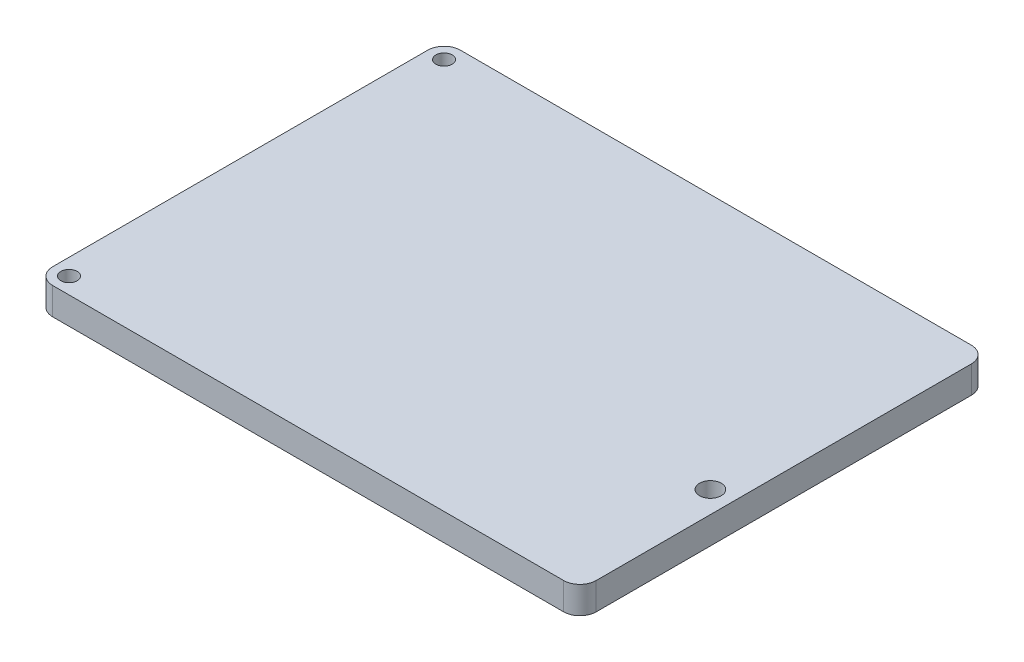
ISO-10303-21;
HEADER;
FILE_DESCRIPTION(('STEP AP214'),'2;1');
FILE_NAME('part.step','',(''),(''),'','','');
FILE_SCHEMA(('AUTOMOTIVE_DESIGN { 1 0 10303 214 1 1 1 1 }'));
ENDSEC;
DATA;
#1=APPLICATION_CONTEXT('core data for automotive mechanical design processes');
#2=APPLICATION_PROTOCOL_DEFINITION('international standard','automotive_design',2000,#1);
#3=PRODUCT_CONTEXT('',#1,'mechanical');
#4=PRODUCT('Part','Part','',(#3));
#5=PRODUCT_RELATED_PRODUCT_CATEGORY('part','',(#4));
#6=PRODUCT_DEFINITION_FORMATION('','',#4);
#7=PRODUCT_DEFINITION_CONTEXT('part definition',#1,'design');
#8=PRODUCT_DEFINITION('design','',#6,#7);
#9=PRODUCT_DEFINITION_SHAPE('','',#8);
#10=(LENGTH_UNIT() NAMED_UNIT(*) SI_UNIT(.MILLI.,.METRE.));
#11=(NAMED_UNIT(*) PLANE_ANGLE_UNIT() SI_UNIT($,.RADIAN.));
#12=(NAMED_UNIT(*) SI_UNIT($,.STERADIAN.) SOLID_ANGLE_UNIT());
#13=UNCERTAINTY_MEASURE_WITH_UNIT(LENGTH_MEASURE(1.E-05),#10,'distance_accuracy_value','');
#14=(GEOMETRIC_REPRESENTATION_CONTEXT(3) GLOBAL_UNCERTAINTY_ASSIGNED_CONTEXT((#13)) GLOBAL_UNIT_ASSIGNED_CONTEXT((#10,
#11,#12)) REPRESENTATION_CONTEXT('',''));
#15=CARTESIAN_POINT('',(0.,0.,0.));
#16=DIRECTION('',(0.,0.,1.));
#17=DIRECTION('',(1.,0.,0.));
#18=AXIS2_PLACEMENT_3D('',#15,#16,#17);
#19=CARTESIAN_POINT('',(97.,5.,72.));
#20=DIRECTION('',(0.,1.,0.));
#21=DIRECTION('',(0.,0.,1.));
#22=AXIS2_PLACEMENT_3D('',#19,#20,#21);
#23=PLANE('',#22);
#24=CARTESIAN_POINT('',(3.00000000000001,5.,72.));
#25=DIRECTION('',(0.,1.,0.));
#26=DIRECTION('',(0.,0.,1.));
#27=AXIS2_PLACEMENT_3D('',#24,#25,#26);
#28=CIRCLE('',#27,1.5);
#29=CARTESIAN_POINT('',(3.00000000000001,5.,73.5));
#30=VERTEX_POINT('',#29);
#31=EDGE_CURVE('E216',#30,#30,#28,.T.);
#32=ORIENTED_EDGE('',*,*,#31,.F.);
#33=EDGE_LOOP('',(#32));
#34=FACE_BOUND('',#33,.T.);
#35=CARTESIAN_POINT('',(97.,5.,72.));
#36=DIRECTION('',(0.,1.,0.));
#37=DIRECTION('',(0.,0.,1.));
#38=AXIS2_PLACEMENT_3D('',#35,#36,#37);
#39=CIRCLE('',#38,3.);
#40=CARTESIAN_POINT('',(97.,5.,75.));
#41=VERTEX_POINT('',#40);
#42=CARTESIAN_POINT('',(100.,5.,72.));
#43=VERTEX_POINT('',#42);
#44=EDGE_CURVE('E167',#41,#43,#39,.T.);
#45=ORIENTED_EDGE('',*,*,#44,.T.);
#46=DIRECTION('',(0.,0.,-1.));
#47=VECTOR('',#46,1.);
#48=CARTESIAN_POINT('',(100.,5.,3.00000000000002));
#49=LINE('',#48,#47);
#50=CARTESIAN_POINT('',(100.,5.,3.00000000000002));
#51=VERTEX_POINT('',#50);
#52=EDGE_CURVE('E103',#43,#51,#49,.T.);
#53=ORIENTED_EDGE('',*,*,#52,.T.);
#54=CARTESIAN_POINT('',(97.,5.,3.));
#55=DIRECTION('',(0.,1.,0.));
#56=DIRECTION('',(0.,0.,-1.));
#57=AXIS2_PLACEMENT_3D('',#54,#55,#56);
#58=CIRCLE('',#57,3.);
#59=CARTESIAN_POINT('',(97.,5.,0.));
#60=VERTEX_POINT('',#59);
#61=EDGE_CURVE('E188',#51,#60,#58,.T.);
#62=ORIENTED_EDGE('',*,*,#61,.T.);
#63=DIRECTION('',(-1.,0.,0.));
#64=VECTOR('',#63,1.);
#65=CARTESIAN_POINT('',(3.00000000000002,5.,0.));
#66=LINE('',#65,#64);
#67=CARTESIAN_POINT('',(3.00000000000002,5.,0.));
#68=VERTEX_POINT('',#67);
#69=EDGE_CURVE('E202',#60,#68,#66,.T.);
#70=ORIENTED_EDGE('',*,*,#69,.T.);
#71=CARTESIAN_POINT('',(3.,5.,3.));
#72=DIRECTION('',(0.,1.,0.));
#73=DIRECTION('',(0.,0.,1.));
#74=AXIS2_PLACEMENT_3D('',#71,#72,#73);
#75=CIRCLE('',#74,3.);
#76=CARTESIAN_POINT('',(0.,5.,3.00000000000002));
#77=VERTEX_POINT('',#76);
#78=EDGE_CURVE('E122',#68,#77,#75,.T.);
#79=ORIENTED_EDGE('',*,*,#78,.T.);
#80=DIRECTION('',(0.,0.,1.));
#81=VECTOR('',#80,1.);
#82=CARTESIAN_POINT('',(0.,5.,3.00000000000002));
#83=LINE('',#82,#81);
#84=CARTESIAN_POINT('',(0.,5.,72.));
#85=VERTEX_POINT('',#84);
#86=EDGE_CURVE('E116',#77,#85,#83,.T.);
#87=ORIENTED_EDGE('',*,*,#86,.T.);
#88=CARTESIAN_POINT('',(3.00000000000001,5.,72.));
#89=DIRECTION('',(0.,1.,0.));
#90=DIRECTION('',(0.,0.,1.));
#91=AXIS2_PLACEMENT_3D('',#88,#89,#90);
#92=CIRCLE('',#91,3.);
#93=CARTESIAN_POINT('',(3.00000000000003,5.,75.));
#94=VERTEX_POINT('',#93);
#95=EDGE_CURVE('E120',#85,#94,#92,.T.);
#96=ORIENTED_EDGE('',*,*,#95,.T.);
#97=DIRECTION('',(1.,0.,0.));
#98=VECTOR('',#97,1.);
#99=CARTESIAN_POINT('',(3.00000000000003,5.,75.));
#100=LINE('',#99,#98);
#101=EDGE_CURVE('E60',#94,#41,#100,.T.);
#102=ORIENTED_EDGE('',*,*,#101,.T.);
#103=EDGE_LOOP('',(#45,#53,#62,#70,#79,#87,#96,#102));
#104=FACE_BOUND('',#103,.T.);
#105=CARTESIAN_POINT('',(3.,5.,3.));
#106=DIRECTION('',(0.,1.,0.));
#107=DIRECTION('',(0.,0.,1.));
#108=AXIS2_PLACEMENT_3D('',#105,#106,#107);
#109=CIRCLE('',#108,1.5);
#110=CARTESIAN_POINT('',(3.,5.,4.5));
#111=VERTEX_POINT('',#110);
#112=EDGE_CURVE('E149',#111,#111,#109,.T.);
#113=ORIENTED_EDGE('',*,*,#112,.F.);
#114=EDGE_LOOP('',(#113));
#115=FACE_BOUND('',#114,.T.);
#116=CARTESIAN_POINT('',(96.,5.,47.));
#117=DIRECTION('',(0.,1.,0.));
#118=DIRECTION('',(0.,0.,1.));
#119=AXIS2_PLACEMENT_3D('',#116,#117,#118);
#120=CIRCLE('',#119,2.);
#121=CARTESIAN_POINT('',(96.,5.,49.));
#122=VERTEX_POINT('',#121);
#123=EDGE_CURVE('E224',#122,#122,#120,.T.);
#124=ORIENTED_EDGE('',*,*,#123,.F.);
#125=EDGE_LOOP('',(#124));
#126=FACE_BOUND('',#125,.T.);
#127=ADVANCED_FACE('F42',(#34,#104,#115,#126),#23,.T.);
#128=CARTESIAN_POINT('',(97.,0.,72.));
#129=DIRECTION('',(0.,1.,0.));
#130=DIRECTION('',(0.,0.,1.));
#131=AXIS2_PLACEMENT_3D('',#128,#129,#130);
#132=PLANE('',#131);
#133=CARTESIAN_POINT('',(97.,0.,72.));
#134=DIRECTION('',(0.,1.,0.));
#135=DIRECTION('',(0.,0.,1.));
#136=AXIS2_PLACEMENT_3D('',#133,#134,#135);
#137=CIRCLE('',#136,3.);
#138=CARTESIAN_POINT('',(97.,0.,75.));
#139=VERTEX_POINT('',#138);
#140=CARTESIAN_POINT('',(100.,0.,72.));
#141=VERTEX_POINT('',#140);
#142=EDGE_CURVE('E144',#139,#141,#137,.T.);
#143=ORIENTED_EDGE('',*,*,#142,.F.);
#144=DIRECTION('',(1.,0.,0.));
#145=VECTOR('',#144,1.);
#146=CARTESIAN_POINT('',(3.00000000000003,0.,75.));
#147=LINE('',#146,#145);
#148=CARTESIAN_POINT('',(3.00000000000003,0.,75.));
#149=VERTEX_POINT('',#148);
#150=EDGE_CURVE('E95',#149,#139,#147,.T.);
#151=ORIENTED_EDGE('',*,*,#150,.F.);
#152=CARTESIAN_POINT('',(3.00000000000001,0.,72.));
#153=DIRECTION('',(0.,1.,0.));
#154=DIRECTION('',(0.,0.,1.));
#155=AXIS2_PLACEMENT_3D('',#152,#153,#154);
#156=CIRCLE('',#155,3.);
#157=CARTESIAN_POINT('',(0.,0.,72.));
#158=VERTEX_POINT('',#157);
#159=EDGE_CURVE('E89',#158,#149,#156,.T.);
#160=ORIENTED_EDGE('',*,*,#159,.F.);
#161=DIRECTION('',(0.,0.,1.));
#162=VECTOR('',#161,1.);
#163=CARTESIAN_POINT('',(0.,0.,3.00000000000002));
#164=LINE('',#163,#162);
#165=CARTESIAN_POINT('',(0.,0.,3.00000000000002));
#166=VERTEX_POINT('',#165);
#167=EDGE_CURVE('E131',#166,#158,#164,.T.);
#168=ORIENTED_EDGE('',*,*,#167,.F.);
#169=CARTESIAN_POINT('',(3.,0.,3.));
#170=DIRECTION('',(0.,1.,0.));
#171=DIRECTION('',(0.,0.,1.));
#172=AXIS2_PLACEMENT_3D('',#169,#170,#171);
#173=CIRCLE('',#172,3.);
#174=CARTESIAN_POINT('',(3.00000000000002,0.,0.));
#175=VERTEX_POINT('',#174);
#176=EDGE_CURVE('E158',#175,#166,#173,.T.);
#177=ORIENTED_EDGE('',*,*,#176,.F.);
#178=DIRECTION('',(-1.,0.,0.));
#179=VECTOR('',#178,1.);
#180=CARTESIAN_POINT('',(3.00000000000002,0.,0.));
#181=LINE('',#180,#179);
#182=CARTESIAN_POINT('',(97.,0.,0.));
#183=VERTEX_POINT('',#182);
#184=EDGE_CURVE('E155',#183,#175,#181,.T.);
#185=ORIENTED_EDGE('',*,*,#184,.F.);
#186=CARTESIAN_POINT('',(97.,0.,3.));
#187=DIRECTION('',(0.,1.,0.));
#188=DIRECTION('',(0.,0.,-1.));
#189=AXIS2_PLACEMENT_3D('',#186,#187,#188);
#190=CIRCLE('',#189,3.);
#191=CARTESIAN_POINT('',(100.,0.,3.00000000000002));
#192=VERTEX_POINT('',#191);
#193=EDGE_CURVE('E152',#192,#183,#190,.T.);
#194=ORIENTED_EDGE('',*,*,#193,.F.);
#195=DIRECTION('',(0.,0.,-1.));
#196=VECTOR('',#195,1.);
#197=CARTESIAN_POINT('',(100.,0.,3.00000000000002));
#198=LINE('',#197,#196);
#199=EDGE_CURVE('E148',#141,#192,#198,.T.);
#200=ORIENTED_EDGE('',*,*,#199,.F.);
#201=EDGE_LOOP('',(#143,#151,#160,#168,#177,#185,#194,#200));
#202=FACE_BOUND('',#201,.T.);
#203=CARTESIAN_POINT('',(3.,0.,3.));
#204=DIRECTION('',(0.,1.,0.));
#205=DIRECTION('',(0.,0.,1.));
#206=AXIS2_PLACEMENT_3D('',#203,#204,#205);
#207=CIRCLE('',#206,1.5);
#208=CARTESIAN_POINT('',(3.,0.,4.5));
#209=VERTEX_POINT('',#208);
#210=EDGE_CURVE('E212',#209,#209,#207,.T.);
#211=ORIENTED_EDGE('',*,*,#210,.T.);
#212=EDGE_LOOP('',(#211));
#213=FACE_BOUND('',#212,.T.);
#214=CARTESIAN_POINT('',(3.00000000000001,0.,72.));
#215=DIRECTION('',(0.,1.,0.));
#216=DIRECTION('',(0.,0.,1.));
#217=AXIS2_PLACEMENT_3D('',#214,#215,#216);
#218=CIRCLE('',#217,1.5);
#219=CARTESIAN_POINT('',(3.00000000000001,0.,73.5));
#220=VERTEX_POINT('',#219);
#221=EDGE_CURVE('E220',#220,#220,#218,.T.);
#222=ORIENTED_EDGE('',*,*,#221,.T.);
#223=EDGE_LOOP('',(#222));
#224=FACE_BOUND('',#223,.T.);
#225=CARTESIAN_POINT('',(96.,0.,47.));
#226=DIRECTION('',(0.,1.,0.));
#227=DIRECTION('',(0.,0.,1.));
#228=AXIS2_PLACEMENT_3D('',#225,#226,#227);
#229=CIRCLE('',#228,2.);
#230=CARTESIAN_POINT('',(96.,0.,49.));
#231=VERTEX_POINT('',#230);
#232=EDGE_CURVE('E228',#231,#231,#229,.T.);
#233=ORIENTED_EDGE('',*,*,#232,.T.);
#234=EDGE_LOOP('',(#233));
#235=FACE_BOUND('',#234,.T.);
#236=ADVANCED_FACE('F192',(#202,#213,#224,#235),#132,.F.);
#237=CARTESIAN_POINT('',(97.,5.,72.));
#238=DIRECTION('',(0.,-1.,0.));
#239=DIRECTION('',(0.,0.,-1.));
#240=AXIS2_PLACEMENT_3D('',#237,#238,#239);
#241=CYLINDRICAL_SURFACE('',#240,3.);
#242=ORIENTED_EDGE('',*,*,#142,.T.);
#243=DIRECTION('',(0.,-1.,0.));
#244=VECTOR('',#243,1.);
#245=CARTESIAN_POINT('',(100.,5.,72.));
#246=LINE('',#245,#244);
#247=EDGE_CURVE('E11',#43,#141,#246,.T.);
#248=ORIENTED_EDGE('',*,*,#247,.F.);
#249=ORIENTED_EDGE('',*,*,#44,.F.);
#250=DIRECTION('',(0.,-1.,0.));
#251=VECTOR('',#250,1.);
#252=CARTESIAN_POINT('',(97.,5.,75.));
#253=LINE('',#252,#251);
#254=EDGE_CURVE('E140',#41,#139,#253,.T.);
#255=ORIENTED_EDGE('',*,*,#254,.T.);
#256=EDGE_LOOP('',(#242,#248,#249,#255));
#257=FACE_BOUND('',#256,.T.);
#258=ADVANCED_FACE('F44',(#257),#241,.T.);
#259=CARTESIAN_POINT('',(100.,5.,3.00000000000002));
#260=DIRECTION('',(-1.,0.,0.));
#261=DIRECTION('',(0.,0.,1.));
#262=AXIS2_PLACEMENT_3D('',#259,#260,#261);
#263=PLANE('',#262);
#264=ORIENTED_EDGE('',*,*,#199,.T.);
#265=DIRECTION('',(0.,-1.,0.));
#266=VECTOR('',#265,1.);
#267=CARTESIAN_POINT('',(100.,5.,3.00000000000002));
#268=LINE('',#267,#266);
#269=EDGE_CURVE('E52',#51,#192,#268,.T.);
#270=ORIENTED_EDGE('',*,*,#269,.F.);
#271=ORIENTED_EDGE('',*,*,#52,.F.);
#272=ORIENTED_EDGE('',*,*,#247,.T.);
#273=EDGE_LOOP('',(#264,#270,#271,#272));
#274=FACE_BOUND('',#273,.T.);
#275=ADVANCED_FACE('F263',(#274),#263,.F.);
#276=CARTESIAN_POINT('',(97.,5.,3.));
#277=DIRECTION('',(0.,-1.,0.));
#278=DIRECTION('',(0.,0.,-1.));
#279=AXIS2_PLACEMENT_3D('',#276,#277,#278);
#280=CYLINDRICAL_SURFACE('',#279,3.);
#281=ORIENTED_EDGE('',*,*,#193,.T.);
#282=DIRECTION('',(0.,-1.,0.));
#283=VECTOR('',#282,1.);
#284=CARTESIAN_POINT('',(97.,5.,0.));
#285=LINE('',#284,#283);
#286=EDGE_CURVE('E178',#60,#183,#285,.T.);
#287=ORIENTED_EDGE('',*,*,#286,.F.);
#288=ORIENTED_EDGE('',*,*,#61,.F.);
#289=ORIENTED_EDGE('',*,*,#269,.T.);
#290=EDGE_LOOP('',(#281,#287,#288,#289));
#291=FACE_BOUND('',#290,.T.);
#292=ADVANCED_FACE('F186',(#291),#280,.T.);
#293=CARTESIAN_POINT('',(3.00000000000002,5.,0.));
#294=DIRECTION('',(0.,0.,1.));
#295=DIRECTION('',(1.,0.,0.));
#296=AXIS2_PLACEMENT_3D('',#293,#294,#295);
#297=PLANE('',#296);
#298=ORIENTED_EDGE('',*,*,#184,.T.);
#299=DIRECTION('',(0.,-1.,0.));
#300=VECTOR('',#299,1.);
#301=CARTESIAN_POINT('',(3.00000000000002,5.,0.));
#302=LINE('',#301,#300);
#303=EDGE_CURVE('E174',#68,#175,#302,.T.);
#304=ORIENTED_EDGE('',*,*,#303,.F.);
#305=ORIENTED_EDGE('',*,*,#69,.F.);
#306=ORIENTED_EDGE('',*,*,#286,.T.);
#307=EDGE_LOOP('',(#298,#304,#305,#306));
#308=FACE_BOUND('',#307,.T.);
#309=ADVANCED_FACE('F197',(#308),#297,.F.);
#310=CARTESIAN_POINT('',(3.,5.,3.));
#311=DIRECTION('',(0.,-1.,0.));
#312=DIRECTION('',(0.,0.,-1.));
#313=AXIS2_PLACEMENT_3D('',#310,#311,#312);
#314=CYLINDRICAL_SURFACE('',#313,3.);
#315=ORIENTED_EDGE('',*,*,#176,.T.);
#316=DIRECTION('',(0.,-1.,0.));
#317=VECTOR('',#316,1.);
#318=CARTESIAN_POINT('',(0.,5.,3.00000000000002));
#319=LINE('',#318,#317);
#320=EDGE_CURVE('E133',#77,#166,#319,.T.);
#321=ORIENTED_EDGE('',*,*,#320,.F.);
#322=ORIENTED_EDGE('',*,*,#78,.F.);
#323=ORIENTED_EDGE('',*,*,#303,.T.);
#324=EDGE_LOOP('',(#315,#321,#322,#323));
#325=FACE_BOUND('',#324,.T.);
#326=ADVANCED_FACE('F200',(#325),#314,.T.);
#327=CARTESIAN_POINT('',(0.,5.,3.00000000000002));
#328=DIRECTION('',(1.,0.,0.));
#329=DIRECTION('',(0.,0.,-1.));
#330=AXIS2_PLACEMENT_3D('',#327,#328,#329);
#331=PLANE('',#330);
#332=ORIENTED_EDGE('',*,*,#167,.T.);
#333=DIRECTION('',(0.,-1.,0.));
#334=VECTOR('',#333,1.);
#335=CARTESIAN_POINT('',(0.,5.,72.));
#336=LINE('',#335,#334);
#337=EDGE_CURVE('E128',#85,#158,#336,.T.);
#338=ORIENTED_EDGE('',*,*,#337,.F.);
#339=ORIENTED_EDGE('',*,*,#86,.F.);
#340=ORIENTED_EDGE('',*,*,#320,.T.);
#341=EDGE_LOOP('',(#332,#338,#339,#340));
#342=FACE_BOUND('',#341,.T.);
#343=ADVANCED_FACE('F129',(#342),#331,.F.);
#344=CARTESIAN_POINT('',(3.00000000000001,5.,72.));
#345=DIRECTION('',(0.,-1.,0.));
#346=DIRECTION('',(0.,0.,-1.));
#347=AXIS2_PLACEMENT_3D('',#344,#345,#346);
#348=CYLINDRICAL_SURFACE('',#347,3.);
#349=ORIENTED_EDGE('',*,*,#159,.T.);
#350=DIRECTION('',(0.,-1.,0.));
#351=VECTOR('',#350,1.);
#352=CARTESIAN_POINT('',(3.00000000000003,5.,75.));
#353=LINE('',#352,#351);
#354=EDGE_CURVE('E134',#94,#149,#353,.T.);
#355=ORIENTED_EDGE('',*,*,#354,.F.);
#356=ORIENTED_EDGE('',*,*,#95,.F.);
#357=ORIENTED_EDGE('',*,*,#337,.T.);
#358=EDGE_LOOP('',(#349,#355,#356,#357));
#359=FACE_BOUND('',#358,.T.);
#360=ADVANCED_FACE('F136',(#359),#348,.T.);
#361=CARTESIAN_POINT('',(3.00000000000003,5.,75.));
#362=DIRECTION('',(0.,0.,-1.));
#363=DIRECTION('',(-1.,0.,0.));
#364=AXIS2_PLACEMENT_3D('',#361,#362,#363);
#365=PLANE('',#364);
#366=ORIENTED_EDGE('',*,*,#150,.T.);
#367=ORIENTED_EDGE('',*,*,#254,.F.);
#368=ORIENTED_EDGE('',*,*,#101,.F.);
#369=ORIENTED_EDGE('',*,*,#354,.T.);
#370=EDGE_LOOP('',(#366,#367,#368,#369));
#371=FACE_BOUND('',#370,.T.);
#372=ADVANCED_FACE('F251',(#371),#365,.F.);
#373=CARTESIAN_POINT('',(3.,5.,3.));
#374=DIRECTION('',(0.,-1.,0.));
#375=DIRECTION('',(0.,0.,-1.));
#376=AXIS2_PLACEMENT_3D('',#373,#374,#375);
#377=CYLINDRICAL_SURFACE('',#376,1.5);
#378=ORIENTED_EDGE('',*,*,#112,.T.);
#379=EDGE_LOOP('',(#378));
#380=FACE_BOUND('',#379,.T.);
#381=ORIENTED_EDGE('',*,*,#210,.F.);
#382=EDGE_LOOP('',(#381));
#383=FACE_BOUND('',#382,.T.);
#384=ADVANCED_FACE('F248',(#380,#383),#377,.F.);
#385=CARTESIAN_POINT('',(3.00000000000001,5.,72.));
#386=DIRECTION('',(0.,-1.,0.));
#387=DIRECTION('',(0.,0.,-1.));
#388=AXIS2_PLACEMENT_3D('',#385,#386,#387);
#389=CYLINDRICAL_SURFACE('',#388,1.5);
#390=ORIENTED_EDGE('',*,*,#31,.T.);
#391=EDGE_LOOP('',(#390));
#392=FACE_BOUND('',#391,.T.);
#393=ORIENTED_EDGE('',*,*,#221,.F.);
#394=EDGE_LOOP('',(#393));
#395=FACE_BOUND('',#394,.T.);
#396=ADVANCED_FACE('F339',(#392,#395),#389,.F.);
#397=CARTESIAN_POINT('',(96.,5.,47.));
#398=DIRECTION('',(0.,-1.,0.));
#399=DIRECTION('',(0.,0.,-1.));
#400=AXIS2_PLACEMENT_3D('',#397,#398,#399);
#401=CYLINDRICAL_SURFACE('',#400,2.);
#402=ORIENTED_EDGE('',*,*,#123,.T.);
#403=EDGE_LOOP('',(#402));
#404=FACE_BOUND('',#403,.T.);
#405=ORIENTED_EDGE('',*,*,#232,.F.);
#406=EDGE_LOOP('',(#405));
#407=FACE_BOUND('',#406,.T.);
#408=ADVANCED_FACE('F236',(#404,#407),#401,.F.);
#409=CLOSED_SHELL('',(#127,#236,#258,#275,#292,#309,#326,#343,#360,#372,#384,#396,#408));
#410=MANIFOLD_SOLID_BREP('B2',#409);
#411=ADVANCED_BREP_SHAPE_REPRESENTATION('',(#18,#410),#14);
#412=SHAPE_DEFINITION_REPRESENTATION(#9,#411);
ENDSEC;
END-ISO-10303-21;
